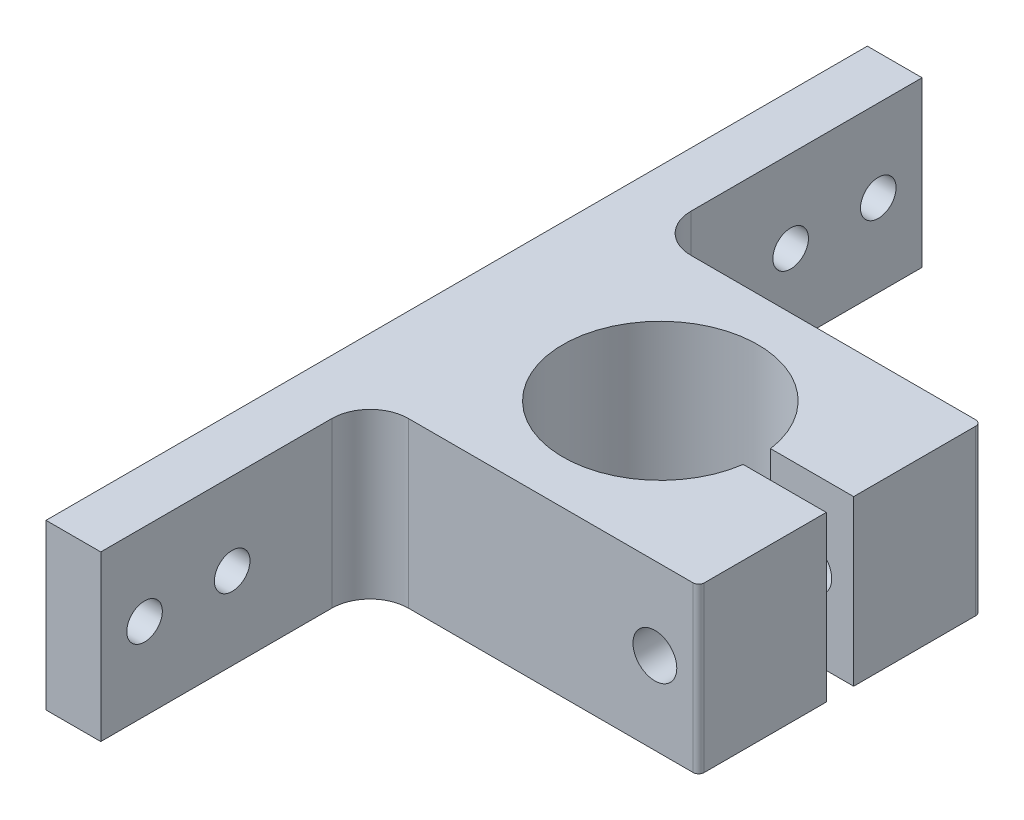
ISO-10303-21;
HEADER;
FILE_DESCRIPTION(('STEP AP214'),'2;1');
FILE_NAME('part.step','',(''),(''),'','','');
FILE_SCHEMA(('AUTOMOTIVE_DESIGN { 1 0 10303 214 1 1 1 1 }'));
ENDSEC;
DATA;
#1=APPLICATION_CONTEXT('core data for automotive mechanical design processes');
#2=APPLICATION_PROTOCOL_DEFINITION('international standard','automotive_design',2000,#1);
#3=PRODUCT_CONTEXT('',#1,'mechanical');
#4=PRODUCT('Part','Part','',(#3));
#5=PRODUCT_RELATED_PRODUCT_CATEGORY('part','',(#4));
#6=PRODUCT_DEFINITION_FORMATION('','',#4);
#7=PRODUCT_DEFINITION_CONTEXT('part definition',#1,'design');
#8=PRODUCT_DEFINITION('design','',#6,#7);
#9=PRODUCT_DEFINITION_SHAPE('','',#8);
#10=(LENGTH_UNIT() NAMED_UNIT(*) SI_UNIT(.MILLI.,.METRE.));
#11=(NAMED_UNIT(*) PLANE_ANGLE_UNIT() SI_UNIT($,.RADIAN.));
#12=(NAMED_UNIT(*) SI_UNIT($,.STERADIAN.) SOLID_ANGLE_UNIT());
#13=UNCERTAINTY_MEASURE_WITH_UNIT(LENGTH_MEASURE(1.E-05),#10,'distance_accuracy_value','');
#14=(GEOMETRIC_REPRESENTATION_CONTEXT(3) GLOBAL_UNCERTAINTY_ASSIGNED_CONTEXT((#13)) GLOBAL_UNIT_ASSIGNED_CONTEXT((#10,
#11,#12)) REPRESENTATION_CONTEXT('',''));
#15=CARTESIAN_POINT('',(0.,0.,0.));
#16=DIRECTION('',(0.,0.,1.));
#17=DIRECTION('',(1.,0.,0.));
#18=AXIS2_PLACEMENT_3D('',#15,#16,#17);
#19=CARTESIAN_POINT('',(70.,30.,-25.8));
#20=DIRECTION('',(-1.,0.,0.));
#21=DIRECTION('',(0.,0.,1.));
#22=AXIS2_PLACEMENT_3D('',#19,#20,#21);
#23=PLANE('',#22);
#24=DIRECTION('',(0.,0.,-1.));
#25=VECTOR('',#24,1.);
#26=CARTESIAN_POINT('',(70.,30.,-25.8));
#27=LINE('',#26,#25);
#28=CARTESIAN_POINT('',(70.,30.,24.8));
#29=VERTEX_POINT('',#28);
#30=CARTESIAN_POINT('',(70.,30.,2.5));
#31=VERTEX_POINT('',#30);
#32=EDGE_CURVE('E283',#29,#31,#27,.T.);
#33=ORIENTED_EDGE('',*,*,#32,.F.);
#34=DIRECTION('',(0.,-1.,0.));
#35=VECTOR('',#34,1.);
#36=CARTESIAN_POINT('',(70.,30.,24.8));
#37=LINE('',#36,#35);
#38=CARTESIAN_POINT('',(70.,0.,24.8));
#39=VERTEX_POINT('',#38);
#40=EDGE_CURVE('E51',#29,#39,#37,.T.);
#41=ORIENTED_EDGE('',*,*,#40,.T.);
#42=DIRECTION('',(0.,0.,-1.));
#43=VECTOR('',#42,1.);
#44=CARTESIAN_POINT('',(70.,0.,-25.8));
#45=LINE('',#44,#43);
#46=CARTESIAN_POINT('',(70.,0.,2.5));
#47=VERTEX_POINT('',#46);
#48=EDGE_CURVE('E185',#39,#47,#45,.T.);
#49=ORIENTED_EDGE('',*,*,#48,.T.);
#50=DIRECTION('',(0.,1.,0.));
#51=VECTOR('',#50,1.);
#52=CARTESIAN_POINT('',(70.,0.,2.5));
#53=LINE('',#52,#51);
#54=EDGE_CURVE('E179',#47,#31,#53,.T.);
#55=ORIENTED_EDGE('',*,*,#54,.T.);
#56=EDGE_LOOP('',(#33,#41,#49,#55));
#57=FACE_BOUND('',#56,.T.);
#58=ADVANCED_FACE('F42',(#57),#23,.F.);
#59=CARTESIAN_POINT('',(0.,30.,0.));
#60=DIRECTION('',(0.,-1.,0.));
#61=DIRECTION('',(0.,0.,-1.));
#62=AXIS2_PLACEMENT_3D('',#59,#60,#61);
#63=PLANE('',#62);
#64=CARTESIAN_POINT('',(70.,30.,-2.5));
#65=VERTEX_POINT('',#64);
#66=CARTESIAN_POINT('',(70.,30.,-24.8));
#67=VERTEX_POINT('',#66);
#68=EDGE_CURVE('E177',#65,#67,#27,.T.);
#69=ORIENTED_EDGE('',*,*,#68,.T.);
#70=CARTESIAN_POINT('',(69.,30.,-24.8));
#71=DIRECTION('',(0.,-1.,0.));
#72=DIRECTION('',(0.,0.,-1.));
#73=AXIS2_PLACEMENT_3D('',#70,#71,#72);
#74=CIRCLE('',#73,1.);
#75=CARTESIAN_POINT('',(69.,30.,-25.8));
#76=VERTEX_POINT('',#75);
#77=EDGE_CURVE('E274',#67,#76,#74,.F.);
#78=ORIENTED_EDGE('',*,*,#77,.T.);
#79=DIRECTION('',(-1.,0.,0.));
#80=VECTOR('',#79,1.);
#81=CARTESIAN_POINT('',(10.,30.,-25.8));
#82=LINE('',#81,#80);
#83=CARTESIAN_POINT('',(17.,30.,-25.8));
#84=VERTEX_POINT('',#83);
#85=EDGE_CURVE('E325',#76,#84,#82,.T.);
#86=ORIENTED_EDGE('',*,*,#85,.T.);
#87=CARTESIAN_POINT('',(17.,30.,-32.8));
#88=DIRECTION('',(0.,-1.,0.));
#89=DIRECTION('',(0.,0.,-1.));
#90=AXIS2_PLACEMENT_3D('',#87,#88,#89);
#91=CIRCLE('',#90,7.);
#92=CARTESIAN_POINT('',(10.,30.,-32.8));
#93=VERTEX_POINT('',#92);
#94=EDGE_CURVE('E251',#84,#93,#91,.T.);
#95=ORIENTED_EDGE('',*,*,#94,.T.);
#96=DIRECTION('',(0.,0.,-1.));
#97=VECTOR('',#96,1.);
#98=CARTESIAN_POINT('',(10.,30.,-75.));
#99=LINE('',#98,#97);
#100=CARTESIAN_POINT('',(10.,30.,-75.));
#101=VERTEX_POINT('',#100);
#102=EDGE_CURVE('E328',#93,#101,#99,.T.);
#103=ORIENTED_EDGE('',*,*,#102,.T.);
#104=DIRECTION('',(-1.,0.,0.));
#105=VECTOR('',#104,1.);
#106=CARTESIAN_POINT('',(0.,30.,-75.));
#107=LINE('',#106,#105);
#108=CARTESIAN_POINT('',(0.,30.,-75.));
#109=VERTEX_POINT('',#108);
#110=EDGE_CURVE('E209',#101,#109,#107,.T.);
#111=ORIENTED_EDGE('',*,*,#110,.T.);
#112=DIRECTION('',(0.,0.,1.));
#113=VECTOR('',#112,1.);
#114=CARTESIAN_POINT('',(0.,30.,-75.));
#115=LINE('',#114,#113);
#116=CARTESIAN_POINT('',(0.,30.,75.));
#117=VERTEX_POINT('',#116);
#118=EDGE_CURVE('E203',#109,#117,#115,.T.);
#119=ORIENTED_EDGE('',*,*,#118,.T.);
#120=DIRECTION('',(1.,0.,0.));
#121=VECTOR('',#120,1.);
#122=CARTESIAN_POINT('',(10.,30.,75.));
#123=LINE('',#122,#121);
#124=CARTESIAN_POINT('',(10.,30.,75.));
#125=VERTEX_POINT('',#124);
#126=EDGE_CURVE('E313',#117,#125,#123,.T.);
#127=ORIENTED_EDGE('',*,*,#126,.T.);
#128=DIRECTION('',(0.,0.,-1.));
#129=VECTOR('',#128,1.);
#130=CARTESIAN_POINT('',(10.,30.,25.8));
#131=LINE('',#130,#129);
#132=CARTESIAN_POINT('',(10.,30.,32.8));
#133=VERTEX_POINT('',#132);
#134=EDGE_CURVE('E316',#125,#133,#131,.T.);
#135=ORIENTED_EDGE('',*,*,#134,.T.);
#136=CARTESIAN_POINT('',(17.,30.,32.8));
#137=DIRECTION('',(0.,-1.,0.));
#138=DIRECTION('',(0.,0.,-1.));
#139=AXIS2_PLACEMENT_3D('',#136,#137,#138);
#140=CIRCLE('',#139,7.);
#141=CARTESIAN_POINT('',(17.,30.,25.8));
#142=VERTEX_POINT('',#141);
#143=EDGE_CURVE('E257',#133,#142,#140,.T.);
#144=ORIENTED_EDGE('',*,*,#143,.T.);
#145=DIRECTION('',(1.,0.,0.));
#146=VECTOR('',#145,1.);
#147=CARTESIAN_POINT('',(70.,30.,25.8));
#148=LINE('',#147,#146);
#149=CARTESIAN_POINT('',(69.,30.,25.8));
#150=VERTEX_POINT('',#149);
#151=EDGE_CURVE('E320',#142,#150,#148,.T.);
#152=ORIENTED_EDGE('',*,*,#151,.T.);
#153=CARTESIAN_POINT('',(69.,30.,24.8));
#154=DIRECTION('',(0.,-1.,0.));
#155=DIRECTION('',(0.,0.,-1.));
#156=AXIS2_PLACEMENT_3D('',#153,#154,#155);
#157=CIRCLE('',#156,1.);
#158=EDGE_CURVE('E63',#150,#29,#157,.F.);
#159=ORIENTED_EDGE('',*,*,#158,.T.);
#160=ORIENTED_EDGE('',*,*,#32,.T.);
#161=DIRECTION('',(1.,0.,0.));
#162=VECTOR('',#161,1.);
#163=CARTESIAN_POINT('',(48.9634779370423,30.,2.5));
#164=LINE('',#163,#162);
#165=CARTESIAN_POINT('',(54.8235637712694,30.,2.5));
#166=VERTEX_POINT('',#165);
#167=EDGE_CURVE('E168',#166,#31,#164,.T.);
#168=ORIENTED_EDGE('',*,*,#167,.F.);
#169=CARTESIAN_POINT('',(37.2,30.,0.));
#170=DIRECTION('',(0.,1.,0.));
#171=DIRECTION('',(0.,0.,1.));
#172=AXIS2_PLACEMENT_3D('',#169,#170,#171);
#173=CIRCLE('',#172,17.8);
#174=CARTESIAN_POINT('',(54.8235637712694,30.,-2.5));
#175=VERTEX_POINT('',#174);
#176=EDGE_CURVE('E303',#175,#166,#173,.T.);
#177=ORIENTED_EDGE('',*,*,#176,.F.);
#178=DIRECTION('',(-1.,0.,0.));
#179=VECTOR('',#178,1.);
#180=CARTESIAN_POINT('',(48.9634779370423,30.,-2.5));
#181=LINE('',#180,#179);
#182=EDGE_CURVE('E294',#65,#175,#181,.T.);
#183=ORIENTED_EDGE('',*,*,#182,.F.);
#184=EDGE_LOOP('',(#69,#78,#86,#95,#103,#111,#119,#127,#135,#144,#152,#159,#160,#168,#177,#183));
#185=FACE_BOUND('',#184,.T.);
#186=ADVANCED_FACE('F350',(#185),#63,.F.);
#187=CARTESIAN_POINT('',(0.,0.,0.));
#188=DIRECTION('',(0.,-1.,0.));
#189=DIRECTION('',(0.,0.,-1.));
#190=AXIS2_PLACEMENT_3D('',#187,#188,#189);
#191=PLANE('',#190);
#192=DIRECTION('',(-1.,0.,0.));
#193=VECTOR('',#192,1.);
#194=CARTESIAN_POINT('',(10.,0.,-25.8));
#195=LINE('',#194,#193);
#196=CARTESIAN_POINT('',(69.,0.,-25.8));
#197=VERTEX_POINT('',#196);
#198=CARTESIAN_POINT('',(17.,0.,-25.8));
#199=VERTEX_POINT('',#198);
#200=EDGE_CURVE('E190',#197,#199,#195,.T.);
#201=ORIENTED_EDGE('',*,*,#200,.F.);
#202=CARTESIAN_POINT('',(69.,0.,-24.8));
#203=DIRECTION('',(0.,-1.,0.));
#204=DIRECTION('',(0.,0.,-1.));
#205=AXIS2_PLACEMENT_3D('',#202,#203,#204);
#206=CIRCLE('',#205,1.);
#207=CARTESIAN_POINT('',(70.,0.,-24.8));
#208=VERTEX_POINT('',#207);
#209=EDGE_CURVE('E183',#197,#208,#206,.T.);
#210=ORIENTED_EDGE('',*,*,#209,.T.);
#211=CARTESIAN_POINT('',(70.,0.,-2.5));
#212=VERTEX_POINT('',#211);
#213=EDGE_CURVE('E174',#212,#208,#45,.T.);
#214=ORIENTED_EDGE('',*,*,#213,.F.);
#215=DIRECTION('',(-1.,0.,0.));
#216=VECTOR('',#215,1.);
#217=CARTESIAN_POINT('',(48.9634779370423,0.,-2.5));
#218=LINE('',#217,#216);
#219=CARTESIAN_POINT('',(54.8235637712694,0.,-2.5));
#220=VERTEX_POINT('',#219);
#221=EDGE_CURVE('E155',#212,#220,#218,.T.);
#222=ORIENTED_EDGE('',*,*,#221,.T.);
#223=CARTESIAN_POINT('',(37.2,0.,0.));
#224=DIRECTION('',(0.,1.,0.));
#225=DIRECTION('',(0.,0.,1.));
#226=AXIS2_PLACEMENT_3D('',#223,#224,#225);
#227=CIRCLE('',#226,17.8);
#228=CARTESIAN_POINT('',(54.8235637712694,0.,2.5));
#229=VERTEX_POINT('',#228);
#230=EDGE_CURVE('E287',#220,#229,#227,.T.);
#231=ORIENTED_EDGE('',*,*,#230,.T.);
#232=DIRECTION('',(1.,0.,0.));
#233=VECTOR('',#232,1.);
#234=CARTESIAN_POINT('',(48.9634779370423,0.,2.5));
#235=LINE('',#234,#233);
#236=EDGE_CURVE('E167',#229,#47,#235,.T.);
#237=ORIENTED_EDGE('',*,*,#236,.T.);
#238=ORIENTED_EDGE('',*,*,#48,.F.);
#239=CARTESIAN_POINT('',(69.,0.,24.8));
#240=DIRECTION('',(0.,-1.,0.));
#241=DIRECTION('',(0.,0.,-1.));
#242=AXIS2_PLACEMENT_3D('',#239,#240,#241);
#243=CIRCLE('',#242,1.);
#244=CARTESIAN_POINT('',(69.,0.,25.8));
#245=VERTEX_POINT('',#244);
#246=EDGE_CURVE('E264',#39,#245,#243,.T.);
#247=ORIENTED_EDGE('',*,*,#246,.T.);
#248=DIRECTION('',(1.,0.,0.));
#249=VECTOR('',#248,1.);
#250=CARTESIAN_POINT('',(70.,0.,25.8));
#251=LINE('',#250,#249);
#252=CARTESIAN_POINT('',(17.,0.,25.8));
#253=VERTEX_POINT('',#252);
#254=EDGE_CURVE('E186',#253,#245,#251,.T.);
#255=ORIENTED_EDGE('',*,*,#254,.F.);
#256=CARTESIAN_POINT('',(17.,0.,32.8));
#257=DIRECTION('',(0.,-1.,0.));
#258=DIRECTION('',(0.,0.,-1.));
#259=AXIS2_PLACEMENT_3D('',#256,#257,#258);
#260=CIRCLE('',#259,7.);
#261=CARTESIAN_POINT('',(10.,0.,32.8));
#262=VERTEX_POINT('',#261);
#263=EDGE_CURVE('E254',#253,#262,#260,.F.);
#264=ORIENTED_EDGE('',*,*,#263,.T.);
#265=DIRECTION('',(0.,0.,-1.));
#266=VECTOR('',#265,1.);
#267=CARTESIAN_POINT('',(10.,0.,25.8));
#268=LINE('',#267,#266);
#269=CARTESIAN_POINT('',(10.,0.,75.));
#270=VERTEX_POINT('',#269);
#271=EDGE_CURVE('E191',#270,#262,#268,.T.);
#272=ORIENTED_EDGE('',*,*,#271,.F.);
#273=DIRECTION('',(1.,0.,0.));
#274=VECTOR('',#273,1.);
#275=CARTESIAN_POINT('',(10.,0.,75.));
#276=LINE('',#275,#274);
#277=CARTESIAN_POINT('',(0.,0.,75.));
#278=VERTEX_POINT('',#277);
#279=EDGE_CURVE('E336',#278,#270,#276,.T.);
#280=ORIENTED_EDGE('',*,*,#279,.F.);
#281=DIRECTION('',(0.,0.,1.));
#282=VECTOR('',#281,1.);
#283=CARTESIAN_POINT('',(0.,0.,-75.));
#284=LINE('',#283,#282);
#285=CARTESIAN_POINT('',(0.,0.,-75.));
#286=VERTEX_POINT('',#285);
#287=EDGE_CURVE('E307',#286,#278,#284,.T.);
#288=ORIENTED_EDGE('',*,*,#287,.F.);
#289=DIRECTION('',(-1.,0.,0.));
#290=VECTOR('',#289,1.);
#291=CARTESIAN_POINT('',(0.,0.,-75.));
#292=LINE('',#291,#290);
#293=CARTESIAN_POINT('',(10.,0.,-75.));
#294=VERTEX_POINT('',#293);
#295=EDGE_CURVE('E200',#294,#286,#292,.T.);
#296=ORIENTED_EDGE('',*,*,#295,.F.);
#297=DIRECTION('',(0.,0.,-1.));
#298=VECTOR('',#297,1.);
#299=CARTESIAN_POINT('',(10.,0.,-75.));
#300=LINE('',#299,#298);
#301=CARTESIAN_POINT('',(10.,0.,-32.8));
#302=VERTEX_POINT('',#301);
#303=EDGE_CURVE('E197',#302,#294,#300,.T.);
#304=ORIENTED_EDGE('',*,*,#303,.F.);
#305=CARTESIAN_POINT('',(17.,0.,-32.8));
#306=DIRECTION('',(0.,-1.,0.));
#307=DIRECTION('',(0.,0.,-1.));
#308=AXIS2_PLACEMENT_3D('',#305,#306,#307);
#309=CIRCLE('',#308,7.);
#310=EDGE_CURVE('E247',#302,#199,#309,.F.);
#311=ORIENTED_EDGE('',*,*,#310,.T.);
#312=EDGE_LOOP('',(#201,#210,#214,#222,#231,#237,#238,#247,#255,#264,#272,#280,#288,#296,#304,#311));
#313=FACE_BOUND('',#312,.T.);
#314=ADVANCED_FACE('F182',(#313),#191,.T.);
#315=CARTESIAN_POINT('',(0.,30.,-75.));
#316=DIRECTION('',(1.,0.,0.));
#317=DIRECTION('',(0.,0.,-1.));
#318=AXIS2_PLACEMENT_3D('',#315,#316,#317);
#319=PLANE('',#318);
#320=CARTESIAN_POINT('',(0.,15.,67.));
#321=DIRECTION('',(1.,0.,0.));
#322=DIRECTION('',(0.,0.,-1.));
#323=AXIS2_PLACEMENT_3D('',#320,#321,#322);
#324=CIRCLE('',#323,3.25000000000001);
#325=CARTESIAN_POINT('',(0.,15.,63.75));
#326=VERTEX_POINT('',#325);
#327=EDGE_CURVE('E667',#326,#326,#324,.T.);
#328=ORIENTED_EDGE('',*,*,#327,.T.);
#329=EDGE_LOOP('',(#328));
#330=FACE_BOUND('',#329,.T.);
#331=CARTESIAN_POINT('',(0.,15.,-51.));
#332=DIRECTION('',(1.,0.,0.));
#333=DIRECTION('',(0.,0.,1.));
#334=AXIS2_PLACEMENT_3D('',#331,#332,#333);
#335=CIRCLE('',#334,3.24999999999999);
#336=CARTESIAN_POINT('',(0.,15.,-47.75));
#337=VERTEX_POINT('',#336);
#338=EDGE_CURVE('E686',#337,#337,#335,.T.);
#339=ORIENTED_EDGE('',*,*,#338,.T.);
#340=EDGE_LOOP('',(#339));
#341=FACE_BOUND('',#340,.T.);
#342=CARTESIAN_POINT('',(0.,15.,-67.));
#343=DIRECTION('',(1.,0.,0.));
#344=DIRECTION('',(0.,0.,1.));
#345=AXIS2_PLACEMENT_3D('',#342,#343,#344);
#346=CIRCLE('',#345,3.25000000000002);
#347=CARTESIAN_POINT('',(0.,15.,-63.75));
#348=VERTEX_POINT('',#347);
#349=EDGE_CURVE('E653',#348,#348,#346,.T.);
#350=ORIENTED_EDGE('',*,*,#349,.T.);
#351=EDGE_LOOP('',(#350));
#352=FACE_BOUND('',#351,.T.);
#353=CARTESIAN_POINT('',(0.,15.,51.));
#354=DIRECTION('',(1.,0.,0.));
#355=DIRECTION('',(0.,0.,-1.));
#356=AXIS2_PLACEMENT_3D('',#353,#354,#355);
#357=CIRCLE('',#356,3.25);
#358=CARTESIAN_POINT('',(0.,15.,47.75));
#359=VERTEX_POINT('',#358);
#360=EDGE_CURVE('E652',#359,#359,#357,.T.);
#361=ORIENTED_EDGE('',*,*,#360,.T.);
#362=EDGE_LOOP('',(#361));
#363=FACE_BOUND('',#362,.T.);
#364=ORIENTED_EDGE('',*,*,#287,.T.);
#365=DIRECTION('',(0.,-1.,0.));
#366=VECTOR('',#365,1.);
#367=CARTESIAN_POINT('',(0.,30.,75.));
#368=LINE('',#367,#366);
#369=EDGE_CURVE('E217',#117,#278,#368,.T.);
#370=ORIENTED_EDGE('',*,*,#369,.F.);
#371=ORIENTED_EDGE('',*,*,#118,.F.);
#372=DIRECTION('',(0.,-1.,0.));
#373=VECTOR('',#372,1.);
#374=CARTESIAN_POINT('',(0.,30.,-75.));
#375=LINE('',#374,#373);
#376=EDGE_CURVE('E204',#109,#286,#375,.T.);
#377=ORIENTED_EDGE('',*,*,#376,.T.);
#378=EDGE_LOOP('',(#364,#370,#371,#377));
#379=FACE_BOUND('',#378,.T.);
#380=ADVANCED_FACE('F385',(#330,#341,#352,#363,#379),#319,.F.);
#381=CARTESIAN_POINT('',(10.,30.,75.));
#382=DIRECTION('',(0.,0.,-1.));
#383=DIRECTION('',(-1.,0.,0.));
#384=AXIS2_PLACEMENT_3D('',#381,#382,#383);
#385=PLANE('',#384);
#386=ORIENTED_EDGE('',*,*,#279,.T.);
#387=DIRECTION('',(0.,-1.,0.));
#388=VECTOR('',#387,1.);
#389=CARTESIAN_POINT('',(10.,30.,75.));
#390=LINE('',#389,#388);
#391=EDGE_CURVE('E213',#125,#270,#390,.T.);
#392=ORIENTED_EDGE('',*,*,#391,.F.);
#393=ORIENTED_EDGE('',*,*,#126,.F.);
#394=ORIENTED_EDGE('',*,*,#369,.T.);
#395=EDGE_LOOP('',(#386,#392,#393,#394));
#396=FACE_BOUND('',#395,.T.);
#397=ADVANCED_FACE('F378',(#396),#385,.F.);
#398=CARTESIAN_POINT('',(10.,30.,25.8));
#399=DIRECTION('',(-1.,0.,0.));
#400=DIRECTION('',(0.,0.,1.));
#401=AXIS2_PLACEMENT_3D('',#398,#399,#400);
#402=PLANE('',#401);
#403=CARTESIAN_POINT('',(10.,15.,67.));
#404=DIRECTION('',(1.,0.,0.));
#405=DIRECTION('',(0.,0.,-1.));
#406=AXIS2_PLACEMENT_3D('',#403,#404,#405);
#407=CIRCLE('',#406,3.25000000000001);
#408=CARTESIAN_POINT('',(10.,15.,63.75));
#409=VERTEX_POINT('',#408);
#410=EDGE_CURVE('E677',#409,#409,#407,.T.);
#411=ORIENTED_EDGE('',*,*,#410,.F.);
#412=EDGE_LOOP('',(#411));
#413=FACE_BOUND('',#412,.T.);
#414=CARTESIAN_POINT('',(10.,15.,51.));
#415=DIRECTION('',(1.,0.,0.));
#416=DIRECTION('',(0.,0.,-1.));
#417=AXIS2_PLACEMENT_3D('',#414,#415,#416);
#418=CIRCLE('',#417,3.25);
#419=CARTESIAN_POINT('',(10.,15.,47.75));
#420=VERTEX_POINT('',#419);
#421=EDGE_CURVE('E658',#420,#420,#418,.T.);
#422=ORIENTED_EDGE('',*,*,#421,.F.);
#423=EDGE_LOOP('',(#422));
#424=FACE_BOUND('',#423,.T.);
#425=ORIENTED_EDGE('',*,*,#271,.T.);
#426=DIRECTION('',(0.,-1.,0.));
#427=VECTOR('',#426,1.);
#428=CARTESIAN_POINT('',(10.,30.,32.8));
#429=LINE('',#428,#427);
#430=EDGE_CURVE('E244',#262,#133,#429,.F.);
#431=ORIENTED_EDGE('',*,*,#430,.T.);
#432=ORIENTED_EDGE('',*,*,#134,.F.);
#433=ORIENTED_EDGE('',*,*,#391,.T.);
#434=EDGE_LOOP('',(#425,#431,#432,#433));
#435=FACE_BOUND('',#434,.T.);
#436=ADVANCED_FACE('F343',(#413,#424,#435),#402,.F.);
#437=CARTESIAN_POINT('',(70.,30.,25.8));
#438=DIRECTION('',(0.,0.,-1.));
#439=DIRECTION('',(-1.,0.,0.));
#440=AXIS2_PLACEMENT_3D('',#437,#438,#439);
#441=PLANE('',#440);
#442=CARTESIAN_POINT('',(62.,15.,25.8));
#443=DIRECTION('',(0.,0.,1.));
#444=DIRECTION('',(1.,0.,0.));
#445=AXIS2_PLACEMENT_3D('',#442,#443,#444);
#446=CIRCLE('',#445,4.00000000000001);
#447=CARTESIAN_POINT('',(66.,15.,25.8));
#448=VERTEX_POINT('',#447);
#449=EDGE_CURVE('E232',#448,#448,#446,.T.);
#450=ORIENTED_EDGE('',*,*,#449,.F.);
#451=EDGE_LOOP('',(#450));
#452=FACE_BOUND('',#451,.T.);
#453=ORIENTED_EDGE('',*,*,#254,.T.);
#454=DIRECTION('',(0.,-1.,0.));
#455=VECTOR('',#454,1.);
#456=CARTESIAN_POINT('',(69.,30.,25.8));
#457=LINE('',#456,#455);
#458=EDGE_CURVE('E11',#245,#150,#457,.F.);
#459=ORIENTED_EDGE('',*,*,#458,.T.);
#460=ORIENTED_EDGE('',*,*,#151,.F.);
#461=DIRECTION('',(0.,-1.,0.));
#462=VECTOR('',#461,1.);
#463=CARTESIAN_POINT('',(17.,0.,25.8));
#464=LINE('',#463,#462);
#465=EDGE_CURVE('E240',#142,#253,#464,.T.);
#466=ORIENTED_EDGE('',*,*,#465,.T.);
#467=EDGE_LOOP('',(#453,#459,#460,#466));
#468=FACE_BOUND('',#467,.T.);
#469=ADVANCED_FACE('F351',(#452,#468),#441,.F.);
#470=ORIENTED_EDGE('',*,*,#213,.T.);
#471=DIRECTION('',(0.,-1.,0.));
#472=VECTOR('',#471,1.);
#473=CARTESIAN_POINT('',(70.,30.,-24.8));
#474=LINE('',#473,#472);
#475=EDGE_CURVE('E269',#208,#67,#474,.F.);
#476=ORIENTED_EDGE('',*,*,#475,.T.);
#477=ORIENTED_EDGE('',*,*,#68,.F.);
#478=DIRECTION('',(0.,1.,0.));
#479=VECTOR('',#478,1.);
#480=CARTESIAN_POINT('',(70.,0.,-2.5));
#481=LINE('',#480,#479);
#482=EDGE_CURVE('E158',#212,#65,#481,.T.);
#483=ORIENTED_EDGE('',*,*,#482,.F.);
#484=EDGE_LOOP('',(#470,#476,#477,#483));
#485=FACE_BOUND('',#484,.T.);
#486=ADVANCED_FACE('F173',(#485),#23,.F.);
#487=CARTESIAN_POINT('',(10.,30.,-25.8));
#488=DIRECTION('',(0.,0.,1.));
#489=DIRECTION('',(1.,0.,0.));
#490=AXIS2_PLACEMENT_3D('',#487,#488,#489);
#491=PLANE('',#490);
#492=CARTESIAN_POINT('',(62.,15.,-25.8));
#493=DIRECTION('',(0.,0.,1.));
#494=DIRECTION('',(1.,0.,0.));
#495=AXIS2_PLACEMENT_3D('',#492,#493,#494);
#496=CIRCLE('',#495,4.00000000000001);
#497=CARTESIAN_POINT('',(66.,15.,-25.8));
#498=VERTEX_POINT('',#497);
#499=EDGE_CURVE('E297',#498,#498,#496,.T.);
#500=ORIENTED_EDGE('',*,*,#499,.T.);
#501=EDGE_LOOP('',(#500));
#502=FACE_BOUND('',#501,.T.);
#503=ORIENTED_EDGE('',*,*,#85,.F.);
#504=DIRECTION('',(0.,-1.,0.));
#505=VECTOR('',#504,1.);
#506=CARTESIAN_POINT('',(69.,30.,-25.8));
#507=LINE('',#506,#505);
#508=EDGE_CURVE('E260',#76,#197,#507,.T.);
#509=ORIENTED_EDGE('',*,*,#508,.T.);
#510=ORIENTED_EDGE('',*,*,#200,.T.);
#511=DIRECTION('',(0.,-1.,0.));
#512=VECTOR('',#511,1.);
#513=CARTESIAN_POINT('',(17.,30.,-25.8));
#514=LINE('',#513,#512);
#515=EDGE_CURVE('E236',#199,#84,#514,.F.);
#516=ORIENTED_EDGE('',*,*,#515,.T.);
#517=EDGE_LOOP('',(#503,#509,#510,#516));
#518=FACE_BOUND('',#517,.T.);
#519=ADVANCED_FACE('F367',(#502,#518),#491,.F.);
#520=CARTESIAN_POINT('',(10.,30.,-75.));
#521=DIRECTION('',(-1.,0.,0.));
#522=DIRECTION('',(0.,0.,1.));
#523=AXIS2_PLACEMENT_3D('',#520,#521,#522);
#524=PLANE('',#523);
#525=CARTESIAN_POINT('',(10.,15.,-51.));
#526=DIRECTION('',(1.,0.,0.));
#527=DIRECTION('',(0.,0.,1.));
#528=AXIS2_PLACEMENT_3D('',#525,#526,#527);
#529=CIRCLE('',#528,3.24999999999999);
#530=CARTESIAN_POINT('',(10.,15.,-47.75));
#531=VERTEX_POINT('',#530);
#532=EDGE_CURVE('E625',#531,#531,#529,.T.);
#533=ORIENTED_EDGE('',*,*,#532,.F.);
#534=EDGE_LOOP('',(#533));
#535=FACE_BOUND('',#534,.T.);
#536=CARTESIAN_POINT('',(10.,15.,-67.));
#537=DIRECTION('',(1.,0.,0.));
#538=DIRECTION('',(0.,0.,1.));
#539=AXIS2_PLACEMENT_3D('',#536,#537,#538);
#540=CIRCLE('',#539,3.25000000000002);
#541=CARTESIAN_POINT('',(10.,15.,-63.75));
#542=VERTEX_POINT('',#541);
#543=EDGE_CURVE('E629',#542,#542,#540,.T.);
#544=ORIENTED_EDGE('',*,*,#543,.F.);
#545=EDGE_LOOP('',(#544));
#546=FACE_BOUND('',#545,.T.);
#547=ORIENTED_EDGE('',*,*,#102,.F.);
#548=DIRECTION('',(0.,-1.,0.));
#549=VECTOR('',#548,1.);
#550=CARTESIAN_POINT('',(10.,0.,-32.8));
#551=LINE('',#550,#549);
#552=EDGE_CURVE('E226',#93,#302,#551,.T.);
#553=ORIENTED_EDGE('',*,*,#552,.T.);
#554=ORIENTED_EDGE('',*,*,#303,.T.);
#555=DIRECTION('',(0.,-1.,0.));
#556=VECTOR('',#555,1.);
#557=CARTESIAN_POINT('',(10.,30.,-75.));
#558=LINE('',#557,#556);
#559=EDGE_CURVE('E208',#101,#294,#558,.T.);
#560=ORIENTED_EDGE('',*,*,#559,.F.);
#561=EDGE_LOOP('',(#547,#553,#554,#560));
#562=FACE_BOUND('',#561,.T.);
#563=ADVANCED_FACE('F372',(#535,#546,#562),#524,.F.);
#564=CARTESIAN_POINT('',(0.,30.,-75.));
#565=DIRECTION('',(0.,0.,1.));
#566=DIRECTION('',(1.,0.,0.));
#567=AXIS2_PLACEMENT_3D('',#564,#565,#566);
#568=PLANE('',#567);
#569=ORIENTED_EDGE('',*,*,#295,.T.);
#570=ORIENTED_EDGE('',*,*,#376,.F.);
#571=ORIENTED_EDGE('',*,*,#110,.F.);
#572=ORIENTED_EDGE('',*,*,#559,.T.);
#573=EDGE_LOOP('',(#569,#570,#571,#572));
#574=FACE_BOUND('',#573,.T.);
#575=ADVANCED_FACE('F518',(#574),#568,.F.);
#576=CARTESIAN_POINT('',(37.2,30.,0.));
#577=DIRECTION('',(0.,-1.,0.));
#578=DIRECTION('',(0.,0.,-1.));
#579=AXIS2_PLACEMENT_3D('',#576,#577,#578);
#580=CYLINDRICAL_SURFACE('',#579,17.8);
#581=DIRECTION('',(0.,-1.,0.));
#582=VECTOR('',#581,1.);
#583=CARTESIAN_POINT('',(54.8235637712694,30.,2.5));
#584=LINE('',#583,#582);
#585=EDGE_CURVE('E223',#229,#166,#584,.F.);
#586=ORIENTED_EDGE('',*,*,#585,.F.);
#587=ORIENTED_EDGE('',*,*,#230,.F.);
#588=DIRECTION('',(0.,-1.,0.));
#589=VECTOR('',#588,1.);
#590=CARTESIAN_POINT('',(54.8235637712694,30.,-2.5));
#591=LINE('',#590,#589);
#592=EDGE_CURVE('E161',#175,#220,#591,.T.);
#593=ORIENTED_EDGE('',*,*,#592,.F.);
#594=ORIENTED_EDGE('',*,*,#176,.T.);
#595=EDGE_LOOP('',(#586,#587,#593,#594));
#596=FACE_BOUND('',#595,.T.);
#597=ADVANCED_FACE('F501',(#596),#580,.F.);
#598=CARTESIAN_POINT('',(48.9634779370423,0.,-2.5));
#599=DIRECTION('',(0.,0.,-1.));
#600=DIRECTION('',(-1.,0.,0.));
#601=AXIS2_PLACEMENT_3D('',#598,#599,#600);
#602=PLANE('',#601);
#603=CARTESIAN_POINT('',(62.,15.,-2.5));
#604=DIRECTION('',(0.,0.,-1.));
#605=DIRECTION('',(-1.,0.,0.));
#606=AXIS2_PLACEMENT_3D('',#603,#604,#605);
#607=CIRCLE('',#606,4.00000000000001);
#608=CARTESIAN_POINT('',(66.,15.,-2.50000000000002));
#609=VERTEX_POINT('',#608);
#610=EDGE_CURVE('E231',#609,#609,#607,.T.);
#611=ORIENTED_EDGE('',*,*,#610,.T.);
#612=EDGE_LOOP('',(#611));
#613=FACE_BOUND('',#612,.T.);
#614=ORIENTED_EDGE('',*,*,#592,.T.);
#615=ORIENTED_EDGE('',*,*,#221,.F.);
#616=ORIENTED_EDGE('',*,*,#482,.T.);
#617=ORIENTED_EDGE('',*,*,#182,.T.);
#618=EDGE_LOOP('',(#614,#615,#616,#617));
#619=FACE_BOUND('',#618,.T.);
#620=ADVANCED_FACE('F157',(#613,#619),#602,.F.);
#621=CARTESIAN_POINT('',(48.9634779370423,0.,2.5));
#622=DIRECTION('',(0.,0.,1.));
#623=DIRECTION('',(1.,0.,0.));
#624=AXIS2_PLACEMENT_3D('',#621,#622,#623);
#625=PLANE('',#624);
#626=CARTESIAN_POINT('',(62.,15.,2.5));
#627=DIRECTION('',(0.,0.,1.));
#628=DIRECTION('',(1.,0.,0.));
#629=AXIS2_PLACEMENT_3D('',#626,#627,#628);
#630=CIRCLE('',#629,4.00000000000001);
#631=CARTESIAN_POINT('',(66.,15.,2.49999999999999));
#632=VERTEX_POINT('',#631);
#633=EDGE_CURVE('E227',#632,#632,#630,.T.);
#634=ORIENTED_EDGE('',*,*,#633,.T.);
#635=EDGE_LOOP('',(#634));
#636=FACE_BOUND('',#635,.T.);
#637=ORIENTED_EDGE('',*,*,#585,.T.);
#638=ORIENTED_EDGE('',*,*,#167,.T.);
#639=ORIENTED_EDGE('',*,*,#54,.F.);
#640=ORIENTED_EDGE('',*,*,#236,.F.);
#641=EDGE_LOOP('',(#637,#638,#639,#640));
#642=FACE_BOUND('',#641,.T.);
#643=ADVANCED_FACE('F483',(#636,#642),#625,.F.);
#644=CARTESIAN_POINT('',(62.,15.,-75.));
#645=DIRECTION('',(0.,0.,1.));
#646=DIRECTION('',(1.,0.,0.));
#647=AXIS2_PLACEMENT_3D('',#644,#645,#646);
#648=CYLINDRICAL_SURFACE('',#647,4.00000000000001);
#649=CARTESIAN_POINT('',(66.,15.,25.8));
#650=CARTESIAN_POINT('',(66.,15.,25.5572916666667));
#651=CARTESIAN_POINT('',(66.,15.,25.3145833333333));
#652=CARTESIAN_POINT('',(66.,15.,24.8291666666667));
#653=CARTESIAN_POINT('',(66.,15.,24.5864583333333));
#654=CARTESIAN_POINT('',(66.,15.,24.1010416666667));
#655=CARTESIAN_POINT('',(66.,15.,23.8583333333333));
#656=CARTESIAN_POINT('',(66.,15.,23.3729166666667));
#657=CARTESIAN_POINT('',(66.,15.,23.1302083333333));
#658=CARTESIAN_POINT('',(66.,15.,22.6447916666667));
#659=CARTESIAN_POINT('',(66.,15.,22.4020833333333));
#660=CARTESIAN_POINT('',(66.,15.,21.9166666666667));
#661=CARTESIAN_POINT('',(66.,15.,21.6739583333333));
#662=CARTESIAN_POINT('',(66.,15.,21.1885416666667));
#663=CARTESIAN_POINT('',(66.,15.,20.9458333333333));
#664=CARTESIAN_POINT('',(66.,15.,20.4604166666667));
#665=CARTESIAN_POINT('',(66.,15.,20.2177083333333));
#666=CARTESIAN_POINT('',(66.,15.,19.7322916666667));
#667=CARTESIAN_POINT('',(66.,15.,19.4895833333333));
#668=CARTESIAN_POINT('',(66.,15.,19.0041666666667));
#669=CARTESIAN_POINT('',(66.,15.,18.7614583333333));
#670=CARTESIAN_POINT('',(66.,15.,18.2760416666667));
#671=CARTESIAN_POINT('',(66.,15.,18.0333333333333));
#672=CARTESIAN_POINT('',(66.,15.,17.5479166666667));
#673=CARTESIAN_POINT('',(66.,15.,17.3052083333333));
#674=CARTESIAN_POINT('',(66.,15.,16.8197916666667));
#675=CARTESIAN_POINT('',(66.,15.,16.5770833333333));
#676=CARTESIAN_POINT('',(66.,15.,16.0916666666667));
#677=CARTESIAN_POINT('',(66.,15.,15.8489583333333));
#678=CARTESIAN_POINT('',(66.,15.,15.3635416666667));
#679=CARTESIAN_POINT('',(66.,15.,15.1208333333333));
#680=CARTESIAN_POINT('',(66.,15.,14.6354166666667));
#681=CARTESIAN_POINT('',(66.,15.,14.3927083333333));
#682=CARTESIAN_POINT('',(66.,15.,13.9072916666667));
#683=CARTESIAN_POINT('',(66.,15.,13.6645833333333));
#684=CARTESIAN_POINT('',(66.,15.,13.1791666666667));
#685=CARTESIAN_POINT('',(66.,15.,12.9364583333333));
#686=CARTESIAN_POINT('',(66.,15.,12.4510416666667));
#687=CARTESIAN_POINT('',(66.,15.,12.2083333333333));
#688=CARTESIAN_POINT('',(66.,15.,11.7229166666667));
#689=CARTESIAN_POINT('',(66.,15.,11.4802083333333));
#690=CARTESIAN_POINT('',(66.,15.,10.9947916666667));
#691=CARTESIAN_POINT('',(66.,15.,10.7520833333333));
#692=CARTESIAN_POINT('',(66.,15.,10.2666666666667));
#693=CARTESIAN_POINT('',(66.,15.,10.0239583333333));
#694=CARTESIAN_POINT('',(66.,15.,9.53854166666666));
#695=CARTESIAN_POINT('',(66.,15.,9.29583333333333));
#696=CARTESIAN_POINT('',(66.,15.,8.81041666666666));
#697=CARTESIAN_POINT('',(66.,15.,8.56770833333332));
#698=CARTESIAN_POINT('',(66.,15.,8.08229166666665));
#699=CARTESIAN_POINT('',(66.,15.,7.83958333333332));
#700=CARTESIAN_POINT('',(66.,15.,7.35416666666666));
#701=CARTESIAN_POINT('',(66.,15.,7.11145833333332));
#702=CARTESIAN_POINT('',(66.,15.,6.62604166666666));
#703=CARTESIAN_POINT('',(66.,15.,6.38333333333333));
#704=CARTESIAN_POINT('',(66.,15.,5.89791666666666));
#705=CARTESIAN_POINT('',(66.,15.,5.65520833333332));
#706=CARTESIAN_POINT('',(66.,15.,5.16979166666666));
#707=CARTESIAN_POINT('',(66.,15.,4.92708333333332));
#708=CARTESIAN_POINT('',(66.,15.,4.44166666666665));
#709=CARTESIAN_POINT('',(66.,15.,4.19895833333332));
#710=CARTESIAN_POINT('',(66.,15.,3.71354166666665));
#711=CARTESIAN_POINT('',(66.,15.,3.47083333333332));
#712=CARTESIAN_POINT('',(66.,15.,2.98541666666665));
#713=CARTESIAN_POINT('',(66.,15.,2.74270833333332));
#714=CARTESIAN_POINT('',(66.,15.,2.49999999999999));
#715=B_SPLINE_CURVE_WITH_KNOTS('',3,(#649,#650,#651,#652,#653,#654,#655,#656,#657,#658,#659,
#660,#661,#662,#663,#664,#665,#666,#667,#668,#669,#670,#671,#672,#673,#674,#675,#676,#677,#678,
#679,#680,#681,#682,#683,#684,#685,#686,#687,#688,#689,#690,#691,#692,#693,#694,#695,#696,#697,
#698,#699,#700,#701,#702,#703,#704,#705,#706,#707,#708,#709,#710,#711,#712,#713,#714),
.UNSPECIFIED.,.F.,.F.,(4,2,2,2,2,2,2,2,2,2,2,2,2,2,2,2,2,2,2,2,2,2,2,2,2,2,2,2,2,2,2,2,4),(0.,
0.728124999999996,1.45625000000001,2.184375,2.9125,3.64062500000001,4.36875,5.096875,5.825,
6.55312500000001,7.28125,8.00937500000001,8.73750000000001,9.465625,10.19375,10.921875,11.65,
12.378125,13.10625,13.834375,14.5625,15.290625,16.01875,16.746875,17.475,18.203125,18.93125,
19.659375,20.3875,21.115625,21.84375,22.571875,23.3),.UNSPECIFIED.);
#716=EDGE_CURVE('BSEAM473',#448,#632,#715,.T.);
#717=ORIENTED_EDGE('',*,*,#449,.T.);
#718=ORIENTED_EDGE('',*,*,#633,.F.);
#719=ORIENTED_EDGE('',*,*,#716,.T.);
#720=ORIENTED_EDGE('',*,*,#716,.F.);
#721=EDGE_LOOP('',(#717,#719,#718,#720));
#722=FACE_BOUND('',#721,.T.);
#723=ADVANCED_FACE('F473',(#722),#648,.F.);
#724=CARTESIAN_POINT('',(66.,15.,-2.50000000000002));
#725=CARTESIAN_POINT('',(66.,15.,-2.74270833333335));
#726=CARTESIAN_POINT('',(66.,15.,-2.98541666666668));
#727=CARTESIAN_POINT('',(66.,15.,-3.47083333333335));
#728=CARTESIAN_POINT('',(66.,15.,-3.71354166666669));
#729=CARTESIAN_POINT('',(66.,15.,-4.19895833333335));
#730=CARTESIAN_POINT('',(66.,15.,-4.44166666666669));
#731=CARTESIAN_POINT('',(66.,15.,-4.92708333333335));
#732=CARTESIAN_POINT('',(66.,15.,-5.16979166666668));
#733=CARTESIAN_POINT('',(66.,15.,-5.65520833333335));
#734=CARTESIAN_POINT('',(66.,15.,-5.89791666666668));
#735=CARTESIAN_POINT('',(66.,15.,-6.38333333333335));
#736=CARTESIAN_POINT('',(66.,15.,-6.62604166666668));
#737=CARTESIAN_POINT('',(66.,15.,-7.11145833333335));
#738=CARTESIAN_POINT('',(66.,15.,-7.35416666666668));
#739=CARTESIAN_POINT('',(66.,15.,-7.83958333333335));
#740=CARTESIAN_POINT('',(66.,15.,-8.08229166666668));
#741=CARTESIAN_POINT('',(66.,15.,-8.56770833333335));
#742=CARTESIAN_POINT('',(66.,15.,-8.81041666666668));
#743=CARTESIAN_POINT('',(66.,15.,-9.29583333333334));
#744=CARTESIAN_POINT('',(66.,15.,-9.53854166666668));
#745=CARTESIAN_POINT('',(66.,15.,-10.0239583333334));
#746=CARTESIAN_POINT('',(66.,15.,-10.2666666666667));
#747=CARTESIAN_POINT('',(66.,15.,-10.7520833333333));
#748=CARTESIAN_POINT('',(66.,15.,-10.9947916666667));
#749=CARTESIAN_POINT('',(66.,15.,-11.4802083333333));
#750=CARTESIAN_POINT('',(66.,15.,-11.7229166666667));
#751=CARTESIAN_POINT('',(66.,15.,-12.2083333333333));
#752=CARTESIAN_POINT('',(66.,15.,-12.4510416666667));
#753=CARTESIAN_POINT('',(66.,15.,-12.9364583333333));
#754=CARTESIAN_POINT('',(66.,15.,-13.1791666666667));
#755=CARTESIAN_POINT('',(66.,15.,-13.6645833333333));
#756=CARTESIAN_POINT('',(66.,15.,-13.9072916666667));
#757=CARTESIAN_POINT('',(66.,15.,-14.3927083333333));
#758=CARTESIAN_POINT('',(66.,15.,-14.6354166666667));
#759=CARTESIAN_POINT('',(66.,15.,-15.1208333333333));
#760=CARTESIAN_POINT('',(66.,15.,-15.3635416666667));
#761=CARTESIAN_POINT('',(66.,15.,-15.8489583333333));
#762=CARTESIAN_POINT('',(66.,15.,-16.0916666666667));
#763=CARTESIAN_POINT('',(66.,15.,-16.5770833333333));
#764=CARTESIAN_POINT('',(66.,15.,-16.8197916666667));
#765=CARTESIAN_POINT('',(66.,15.,-17.3052083333333));
#766=CARTESIAN_POINT('',(66.,15.,-17.5479166666667));
#767=CARTESIAN_POINT('',(66.,15.,-18.0333333333333));
#768=CARTESIAN_POINT('',(66.,15.,-18.2760416666667));
#769=CARTESIAN_POINT('',(66.,15.,-18.7614583333333));
#770=CARTESIAN_POINT('',(66.,15.,-19.0041666666667));
#771=CARTESIAN_POINT('',(66.,15.,-19.4895833333333));
#772=CARTESIAN_POINT('',(66.,15.,-19.7322916666667));
#773=CARTESIAN_POINT('',(66.,15.,-20.2177083333333));
#774=CARTESIAN_POINT('',(66.,15.,-20.4604166666667));
#775=CARTESIAN_POINT('',(66.,15.,-20.9458333333333));
#776=CARTESIAN_POINT('',(66.,15.,-21.1885416666667));
#777=CARTESIAN_POINT('',(66.,15.,-21.6739583333333));
#778=CARTESIAN_POINT('',(66.,15.,-21.9166666666667));
#779=CARTESIAN_POINT('',(66.,15.,-22.4020833333333));
#780=CARTESIAN_POINT('',(66.,15.,-22.6447916666667));
#781=CARTESIAN_POINT('',(66.,15.,-23.1302083333333));
#782=CARTESIAN_POINT('',(66.,15.,-23.3729166666667));
#783=CARTESIAN_POINT('',(66.,15.,-23.8583333333333));
#784=CARTESIAN_POINT('',(66.,15.,-24.1010416666667));
#785=CARTESIAN_POINT('',(66.,15.,-24.5864583333333));
#786=CARTESIAN_POINT('',(66.,15.,-24.8291666666667));
#787=CARTESIAN_POINT('',(66.,15.,-25.3145833333333));
#788=CARTESIAN_POINT('',(66.,15.,-25.5572916666667));
#789=CARTESIAN_POINT('',(66.,15.,-25.8));
#790=B_SPLINE_CURVE_WITH_KNOTS('',3,(#724,#725,#726,#727,#728,#729,#730,#731,#732,#733,#734,
#735,#736,#737,#738,#739,#740,#741,#742,#743,#744,#745,#746,#747,#748,#749,#750,#751,#752,#753,
#754,#755,#756,#757,#758,#759,#760,#761,#762,#763,#764,#765,#766,#767,#768,#769,#770,#771,#772,
#773,#774,#775,#776,#777,#778,#779,#780,#781,#782,#783,#784,#785,#786,#787,#788,#789),
.UNSPECIFIED.,.F.,.F.,(4,2,2,2,2,2,2,2,2,2,2,2,2,2,2,2,2,2,2,2,2,2,2,2,2,2,2,2,2,2,2,2,4),(0.,
0.728124999999996,1.45625000000001,2.184375,2.9125,3.64062499999999,4.36875,5.096875,5.825,
6.55312499999999,7.28125,8.009375,8.7375,9.465625,10.19375,10.921875,11.65,12.378125,13.10625,
13.834375,14.5625,15.290625,16.01875,16.746875,17.475,18.203125,18.93125,19.659375,20.3875,
21.115625,21.84375,22.571875,23.3),.UNSPECIFIED.);
#791=EDGE_CURVE('BSEAM463',#609,#498,#790,.T.);
#792=ORIENTED_EDGE('',*,*,#610,.F.);
#793=ORIENTED_EDGE('',*,*,#499,.F.);
#794=ORIENTED_EDGE('',*,*,#791,.T.);
#795=ORIENTED_EDGE('',*,*,#791,.F.);
#796=EDGE_LOOP('',(#792,#794,#793,#795));
#797=FACE_BOUND('',#796,.T.);
#798=ADVANCED_FACE('F463',(#797),#648,.F.);
#799=CARTESIAN_POINT('',(0.,15.,-67.));
#800=DIRECTION('',(1.,0.,0.));
#801=DIRECTION('',(0.,0.,-1.));
#802=AXIS2_PLACEMENT_3D('',#799,#800,#801);
#803=CYLINDRICAL_SURFACE('',#802,3.25000000000002);
#804=ORIENTED_EDGE('',*,*,#349,.F.);
#805=EDGE_LOOP('',(#804));
#806=FACE_BOUND('',#805,.T.);
#807=ORIENTED_EDGE('',*,*,#543,.T.);
#808=EDGE_LOOP('',(#807));
#809=FACE_BOUND('',#808,.T.);
#810=ADVANCED_FACE('F453',(#806,#809),#803,.F.);
#811=CARTESIAN_POINT('',(0.,15.,-51.));
#812=DIRECTION('',(1.,0.,0.));
#813=DIRECTION('',(0.,0.,-1.));
#814=AXIS2_PLACEMENT_3D('',#811,#812,#813);
#815=CYLINDRICAL_SURFACE('',#814,3.24999999999999);
#816=ORIENTED_EDGE('',*,*,#338,.F.);
#817=EDGE_LOOP('',(#816));
#818=FACE_BOUND('',#817,.T.);
#819=ORIENTED_EDGE('',*,*,#532,.T.);
#820=EDGE_LOOP('',(#819));
#821=FACE_BOUND('',#820,.T.);
#822=ADVANCED_FACE('F443',(#818,#821),#815,.F.);
#823=CARTESIAN_POINT('',(0.,15.,51.));
#824=DIRECTION('',(1.,0.,0.));
#825=DIRECTION('',(0.,0.,-1.));
#826=AXIS2_PLACEMENT_3D('',#823,#824,#825);
#827=CYLINDRICAL_SURFACE('',#826,3.25);
#828=ORIENTED_EDGE('',*,*,#360,.F.);
#829=EDGE_LOOP('',(#828));
#830=FACE_BOUND('',#829,.T.);
#831=ORIENTED_EDGE('',*,*,#421,.T.);
#832=EDGE_LOOP('',(#831));
#833=FACE_BOUND('',#832,.T.);
#834=ADVANCED_FACE('F433',(#830,#833),#827,.F.);
#835=CARTESIAN_POINT('',(0.,15.,67.));
#836=DIRECTION('',(1.,0.,0.));
#837=DIRECTION('',(0.,0.,-1.));
#838=AXIS2_PLACEMENT_3D('',#835,#836,#837);
#839=CYLINDRICAL_SURFACE('',#838,3.25000000000001);
#840=ORIENTED_EDGE('',*,*,#327,.F.);
#841=EDGE_LOOP('',(#840));
#842=FACE_BOUND('',#841,.T.);
#843=ORIENTED_EDGE('',*,*,#410,.T.);
#844=EDGE_LOOP('',(#843));
#845=FACE_BOUND('',#844,.T.);
#846=ADVANCED_FACE('F393',(#842,#845),#839,.F.);
#847=CARTESIAN_POINT('',(17.,30.,-32.8));
#848=DIRECTION('',(0.,1.,0.));
#849=DIRECTION('',(0.,0.,1.));
#850=AXIS2_PLACEMENT_3D('',#847,#848,#849);
#851=CYLINDRICAL_SURFACE('',#850,7.);
#852=ORIENTED_EDGE('',*,*,#94,.F.);
#853=ORIENTED_EDGE('',*,*,#515,.F.);
#854=ORIENTED_EDGE('',*,*,#310,.F.);
#855=ORIENTED_EDGE('',*,*,#552,.F.);
#856=EDGE_LOOP('',(#852,#853,#854,#855));
#857=FACE_BOUND('',#856,.T.);
#858=ADVANCED_FACE('F390',(#857),#851,.F.);
#859=CARTESIAN_POINT('',(17.,30.,32.8));
#860=DIRECTION('',(0.,1.,0.));
#861=DIRECTION('',(0.,0.,1.));
#862=AXIS2_PLACEMENT_3D('',#859,#860,#861);
#863=CYLINDRICAL_SURFACE('',#862,7.);
#864=ORIENTED_EDGE('',*,*,#143,.F.);
#865=ORIENTED_EDGE('',*,*,#430,.F.);
#866=ORIENTED_EDGE('',*,*,#263,.F.);
#867=ORIENTED_EDGE('',*,*,#465,.F.);
#868=EDGE_LOOP('',(#864,#865,#866,#867));
#869=FACE_BOUND('',#868,.T.);
#870=ADVANCED_FACE('F348',(#869),#863,.F.);
#871=CARTESIAN_POINT('',(69.,30.,-24.8));
#872=DIRECTION('',(0.,-1.,0.));
#873=DIRECTION('',(0.,0.,-1.));
#874=AXIS2_PLACEMENT_3D('',#871,#872,#873);
#875=CYLINDRICAL_SURFACE('',#874,1.);
#876=ORIENTED_EDGE('',*,*,#77,.F.);
#877=ORIENTED_EDGE('',*,*,#475,.F.);
#878=ORIENTED_EDGE('',*,*,#209,.F.);
#879=ORIENTED_EDGE('',*,*,#508,.F.);
#880=EDGE_LOOP('',(#876,#877,#878,#879));
#881=FACE_BOUND('',#880,.T.);
#882=ADVANCED_FACE('F353',(#881),#875,.T.);
#883=CARTESIAN_POINT('',(69.,30.,24.8));
#884=DIRECTION('',(0.,-1.,0.));
#885=DIRECTION('',(0.,0.,-1.));
#886=AXIS2_PLACEMENT_3D('',#883,#884,#885);
#887=CYLINDRICAL_SURFACE('',#886,1.);
#888=ORIENTED_EDGE('',*,*,#158,.F.);
#889=ORIENTED_EDGE('',*,*,#458,.F.);
#890=ORIENTED_EDGE('',*,*,#246,.F.);
#891=ORIENTED_EDGE('',*,*,#40,.F.);
#892=EDGE_LOOP('',(#888,#889,#890,#891));
#893=FACE_BOUND('',#892,.T.);
#894=ADVANCED_FACE('F44',(#893),#887,.T.);
#895=CLOSED_SHELL('',(#58,#186,#314,#380,#397,#436,#469,#486,#519,#563,#575,#597,#620,#643,#723,
#798,#810,#822,#834,#846,#858,#870,#882,#894));
#896=MANIFOLD_SOLID_BREP('B2',#895);
#897=ADVANCED_BREP_SHAPE_REPRESENTATION('',(#18,#896),#14);
#898=SHAPE_DEFINITION_REPRESENTATION(#9,#897);
ENDSEC;
END-ISO-10303-21;
